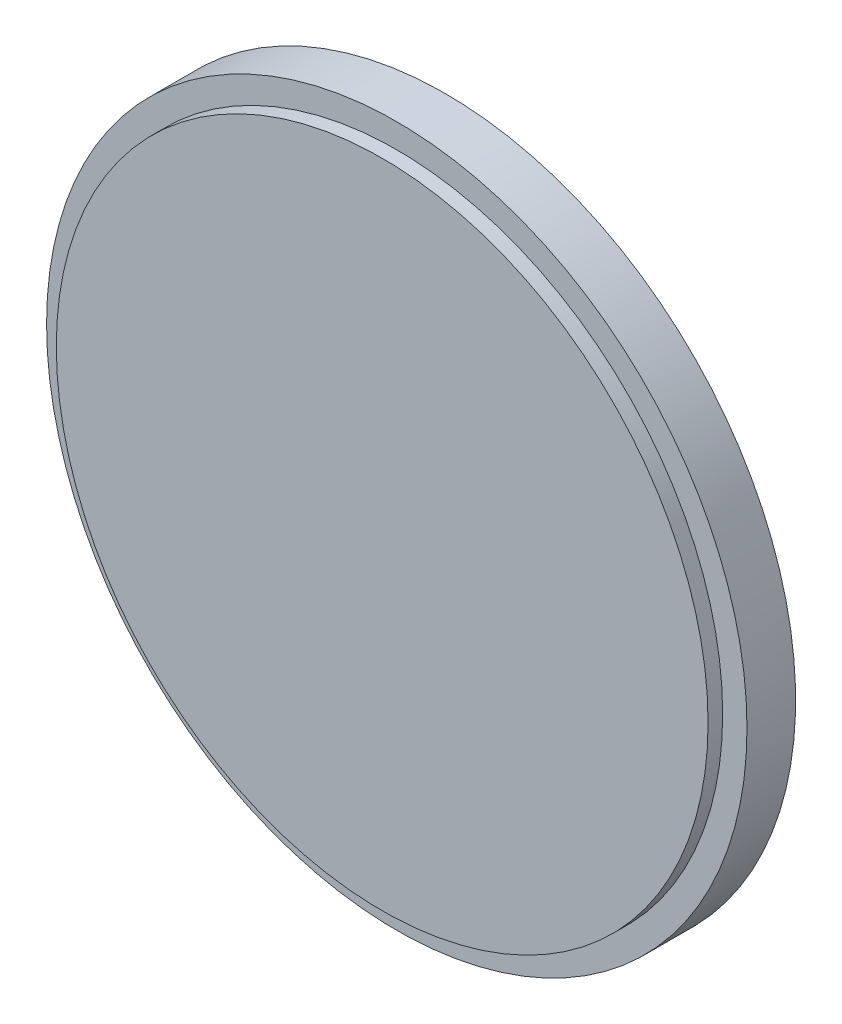
ISO-10303-21;
HEADER;
FILE_DESCRIPTION(('STEP AP214'),'2;1');
FILE_NAME('part.step','',(''),(''),'','','');
FILE_SCHEMA(('AUTOMOTIVE_DESIGN { 1 0 10303 214 1 1 1 1 }'));
ENDSEC;
DATA;
#1=APPLICATION_CONTEXT('core data for automotive mechanical design processes');
#2=APPLICATION_PROTOCOL_DEFINITION('international standard','automotive_design',2000,#1);
#3=PRODUCT_CONTEXT('',#1,'mechanical');
#4=PRODUCT('Part','Part','',(#3));
#5=PRODUCT_RELATED_PRODUCT_CATEGORY('part','',(#4));
#6=PRODUCT_DEFINITION_FORMATION('','',#4);
#7=PRODUCT_DEFINITION_CONTEXT('part definition',#1,'design');
#8=PRODUCT_DEFINITION('design','',#6,#7);
#9=PRODUCT_DEFINITION_SHAPE('','',#8);
#10=(LENGTH_UNIT() NAMED_UNIT(*) SI_UNIT(.MILLI.,.METRE.));
#11=(NAMED_UNIT(*) PLANE_ANGLE_UNIT() SI_UNIT($,.RADIAN.));
#12=(NAMED_UNIT(*) SI_UNIT($,.STERADIAN.) SOLID_ANGLE_UNIT());
#13=UNCERTAINTY_MEASURE_WITH_UNIT(LENGTH_MEASURE(1.E-05),#10,'distance_accuracy_value','');
#14=(GEOMETRIC_REPRESENTATION_CONTEXT(3) GLOBAL_UNCERTAINTY_ASSIGNED_CONTEXT((#13)) GLOBAL_UNIT_ASSIGNED_CONTEXT((#10,
#11,#12)) REPRESENTATION_CONTEXT('',''));
#15=CARTESIAN_POINT('',(0.,0.,0.));
#16=DIRECTION('',(0.,0.,1.));
#17=DIRECTION('',(1.,0.,0.));
#18=AXIS2_PLACEMENT_3D('',#15,#16,#17);
#19=CARTESIAN_POINT('',(0.,0.,0.));
#20=DIRECTION('',(0.,0.,-1.));
#21=DIRECTION('',(-1.,0.,0.));
#22=AXIS2_PLACEMENT_3D('',#19,#20,#21);
#23=CYLINDRICAL_SURFACE('',#22,1.65);
#24=CARTESIAN_POINT('',(0.,0.,-6.85));
#25=DIRECTION('',(0.,-0.707106781186547,-0.707106781186547));
#26=DIRECTION('',(0.,0.707106781186547,-0.707106781186547));
#27=AXIS2_PLACEMENT_3D('',#24,#25,#26);
#28=ELLIPSE('',#27,2.33345237791561,1.65);
#29=CARTESIAN_POINT('',(-1.22983738762488,1.1,-7.95));
#30=VERTEX_POINT('',#29);
#31=CARTESIAN_POINT('',(-1.65,0.,-6.85));
#32=VERTEX_POINT('',#31);
#33=EDGE_CURVE('E59',#30,#32,#28,.F.);
#34=ORIENTED_EDGE('',*,*,#33,.T.);
#35=CARTESIAN_POINT('',(0.,0.,-6.85));
#36=DIRECTION('',(0.,0.707106781186547,-0.707106781186547));
#37=DIRECTION('',(0.,-0.707106781186547,-0.707106781186547));
#38=AXIS2_PLACEMENT_3D('',#35,#36,#37);
#39=ELLIPSE('',#38,2.33345237791561,1.65);
#40=CARTESIAN_POINT('',(1.65,0.,-6.85));
#41=VERTEX_POINT('',#40);
#42=EDGE_CURVE('E147',#32,#41,#39,.F.);
#43=ORIENTED_EDGE('',*,*,#42,.T.);
#44=CARTESIAN_POINT('',(1.22983738762488,1.1,-7.95));
#45=VERTEX_POINT('',#44);
#46=EDGE_CURVE('E53',#41,#45,#28,.F.);
#47=ORIENTED_EDGE('',*,*,#46,.T.);
#48=DIRECTION('',(0.,0.,-1.));
#49=VECTOR('',#48,1.);
#50=CARTESIAN_POINT('',(1.22983738762488,1.1,0.));
#51=LINE('',#50,#49);
#52=CARTESIAN_POINT('',(1.22983738762488,1.1,-11.));
#53=VERTEX_POINT('',#52);
#54=EDGE_CURVE('E153',#45,#53,#51,.T.);
#55=ORIENTED_EDGE('',*,*,#54,.T.);
#56=CARTESIAN_POINT('',(0.,0.,-11.));
#57=DIRECTION('',(0.,0.,-1.));
#58=DIRECTION('',(-1.,0.,0.));
#59=AXIS2_PLACEMENT_3D('',#56,#57,#58);
#60=CIRCLE('',#59,1.65);
#61=CARTESIAN_POINT('',(-1.22983738762488,1.1,-11.));
#62=VERTEX_POINT('',#61);
#63=EDGE_CURVE('E313',#53,#62,#60,.T.);
#64=ORIENTED_EDGE('',*,*,#63,.T.);
#65=DIRECTION('',(0.,0.,-1.));
#66=VECTOR('',#65,1.);
#67=CARTESIAN_POINT('',(-1.22983738762488,1.1,0.));
#68=LINE('',#67,#66);
#69=EDGE_CURVE('E154',#30,#62,#68,.T.);
#70=ORIENTED_EDGE('',*,*,#69,.F.);
#71=EDGE_LOOP('',(#34,#43,#47,#55,#64,#70));
#72=FACE_BOUND('',#71,.T.);
#73=ADVANCED_FACE('F38',(#72),#23,.F.);
#74=CARTESIAN_POINT('',(1.22983738762488,1.1,0.));
#75=DIRECTION('',(0.,1.,0.));
#76=DIRECTION('',(0.,0.,1.));
#77=AXIS2_PLACEMENT_3D('',#74,#75,#76);
#78=PLANE('',#77);
#79=ORIENTED_EDGE('',*,*,#54,.F.);
#80=CARTESIAN_POINT('',(0.,1.1,-6.85));
#81=DIRECTION('',(0.,1.,0.));
#82=DIRECTION('',(0.,0.,1.));
#83=AXIS2_PLACEMENT_3D('',#80,#81,#82);
#84=CIRCLE('',#83,1.65);
#85=EDGE_CURVE('E11',#45,#30,#84,.T.);
#86=ORIENTED_EDGE('',*,*,#85,.T.);
#87=ORIENTED_EDGE('',*,*,#69,.T.);
#88=DIRECTION('',(1.,0.,0.));
#89=VECTOR('',#88,1.);
#90=CARTESIAN_POINT('',(1.22983738762488,1.1,-11.));
#91=LINE('',#90,#89);
#92=EDGE_CURVE('E422',#62,#53,#91,.T.);
#93=ORIENTED_EDGE('',*,*,#92,.T.);
#94=EDGE_LOOP('',(#79,#86,#87,#93));
#95=FACE_BOUND('',#94,.T.);
#96=ADVANCED_FACE('F278',(#95),#78,.F.);
#97=CARTESIAN_POINT('',(0.,0.,1.5));
#98=DIRECTION('',(0.,0.,-1.));
#99=DIRECTION('',(-1.,0.,0.));
#100=AXIS2_PLACEMENT_3D('',#97,#98,#99);
#101=PLANE('',#100);
#102=CARTESIAN_POINT('',(0.,0.,1.5));
#103=DIRECTION('',(0.,0.,-1.));
#104=DIRECTION('',(-1.,0.,0.));
#105=AXIS2_PLACEMENT_3D('',#102,#103,#104);
#106=CIRCLE('',#105,33.5);
#107=CARTESIAN_POINT('',(-33.5,0.,1.5));
#108=VERTEX_POINT('',#107);
#109=EDGE_CURVE('E237',#108,#108,#106,.T.);
#110=ORIENTED_EDGE('',*,*,#109,.F.);
#111=EDGE_LOOP('',(#110));
#112=FACE_BOUND('',#111,.T.);
#113=CARTESIAN_POINT('',(0.,0.,1.5));
#114=DIRECTION('',(0.,0.,-1.));
#115=DIRECTION('',(-1.,0.,0.));
#116=AXIS2_PLACEMENT_3D('',#113,#114,#115);
#117=CIRCLE('',#116,36.);
#118=CARTESIAN_POINT('',(-36.,0.,1.5));
#119=VERTEX_POINT('',#118);
#120=EDGE_CURVE('E160',#119,#119,#117,.T.);
#121=ORIENTED_EDGE('',*,*,#120,.T.);
#122=EDGE_LOOP('',(#121));
#123=FACE_BOUND('',#122,.T.);
#124=ADVANCED_FACE('F284',(#112,#123),#101,.T.);
#125=CARTESIAN_POINT('',(0.,0.,0.));
#126=DIRECTION('',(0.,0.,1.));
#127=DIRECTION('',(1.,0.,0.));
#128=AXIS2_PLACEMENT_3D('',#125,#126,#127);
#129=PLANE('',#128);
#130=CARTESIAN_POINT('',(0.,0.,0.));
#131=DIRECTION('',(0.,0.,1.));
#132=DIRECTION('',(1.,0.,0.));
#133=AXIS2_PLACEMENT_3D('',#130,#131,#132);
#134=CIRCLE('',#133,32.5);
#135=CARTESIAN_POINT('',(32.5,0.,0.));
#136=VERTEX_POINT('',#135);
#137=EDGE_CURVE('E251',#136,#136,#134,.T.);
#138=ORIENTED_EDGE('',*,*,#137,.T.);
#139=EDGE_LOOP('',(#138));
#140=FACE_BOUND('',#139,.T.);
#141=CARTESIAN_POINT('',(0.,0.,0.));
#142=DIRECTION('',(0.,0.,-1.));
#143=DIRECTION('',(-1.,0.,0.));
#144=AXIS2_PLACEMENT_3D('',#141,#142,#143);
#145=CIRCLE('',#144,33.5);
#146=CARTESIAN_POINT('',(-33.5,0.,0.));
#147=VERTEX_POINT('',#146);
#148=EDGE_CURVE('E236',#147,#147,#145,.T.);
#149=ORIENTED_EDGE('',*,*,#148,.T.);
#150=EDGE_LOOP('',(#149));
#151=FACE_BOUND('',#150,.T.);
#152=ADVANCED_FACE('F40',(#140,#151),#129,.F.);
#153=CARTESIAN_POINT('',(0.,0.,8.));
#154=DIRECTION('',(0.,0.,-1.));
#155=DIRECTION('',(-1.,0.,0.));
#156=AXIS2_PLACEMENT_3D('',#153,#154,#155);
#157=CYLINDRICAL_SURFACE('',#156,32.5);
#158=ORIENTED_EDGE('',*,*,#137,.F.);
#159=EDGE_LOOP('',(#158));
#160=FACE_BOUND('',#159,.T.);
#161=CARTESIAN_POINT('',(0.,0.,5.));
#162=DIRECTION('',(0.,0.,1.));
#163=DIRECTION('',(1.,0.,0.));
#164=AXIS2_PLACEMENT_3D('',#161,#162,#163);
#165=CIRCLE('',#164,32.5);
#166=CARTESIAN_POINT('',(32.5,0.,5.));
#167=VERTEX_POINT('',#166);
#168=EDGE_CURVE('E246',#167,#167,#165,.T.);
#169=ORIENTED_EDGE('',*,*,#168,.T.);
#170=EDGE_LOOP('',(#169));
#171=FACE_BOUND('',#170,.T.);
#172=ADVANCED_FACE('F342',(#160,#171),#157,.F.);
#173=CARTESIAN_POINT('',(0.,0.,5.));
#174=DIRECTION('',(0.,0.,1.));
#175=DIRECTION('',(1.,0.,0.));
#176=AXIS2_PLACEMENT_3D('',#173,#174,#175);
#177=PLANE('',#176);
#178=CARTESIAN_POINT('',(0.,0.,5.));
#179=DIRECTION('',(0.,0.,1.));
#180=DIRECTION('',(1.,0.,0.));
#181=AXIS2_PLACEMENT_3D('',#178,#179,#180);
#182=CIRCLE('',#181,10.);
#183=CARTESIAN_POINT('',(10.,0.,5.));
#184=VERTEX_POINT('',#183);
#185=EDGE_CURVE('E254',#184,#184,#182,.F.);
#186=ORIENTED_EDGE('',*,*,#185,.F.);
#187=EDGE_LOOP('',(#186));
#188=FACE_BOUND('',#187,.T.);
#189=ORIENTED_EDGE('',*,*,#168,.F.);
#190=EDGE_LOOP('',(#189));
#191=FACE_BOUND('',#190,.T.);
#192=ADVANCED_FACE('F326',(#188,#191),#177,.F.);
#193=CARTESIAN_POINT('',(0.,0.,1.5));
#194=DIRECTION('',(0.,0.,-1.));
#195=DIRECTION('',(-1.,0.,0.));
#196=AXIS2_PLACEMENT_3D('',#193,#194,#195);
#197=CYLINDRICAL_SURFACE('',#196,33.5);
#198=ORIENTED_EDGE('',*,*,#109,.T.);
#199=EDGE_LOOP('',(#198));
#200=FACE_BOUND('',#199,.T.);
#201=ORIENTED_EDGE('',*,*,#148,.F.);
#202=EDGE_LOOP('',(#201));
#203=FACE_BOUND('',#202,.T.);
#204=ADVANCED_FACE('F321',(#200,#203),#197,.T.);
#205=CARTESIAN_POINT('',(0.,0.,-11.));
#206=DIRECTION('',(0.,0.,1.));
#207=DIRECTION('',(1.,0.,0.));
#208=AXIS2_PLACEMENT_3D('',#205,#206,#207);
#209=CYLINDRICAL_SURFACE('',#208,10.);
#210=CARTESIAN_POINT('',(-1.65,-9.86293566845085,-6.85));
#211=CARTESIAN_POINT('',(-1.64999629098035,-9.86293731785559,-6.75799815763411));
#212=CARTESIAN_POINT('',(-1.64227909123111,-9.86423691212932,-6.66594574295345));
#213=CARTESIAN_POINT('',(-1.61162706431045,-9.86929026153225,-6.48442278665811));
#214=CARTESIAN_POINT('',(-1.58867811875357,-9.8730462934991,-6.39495472085215));
#215=CARTESIAN_POINT('',(-1.5282748949929,-9.88257579035621,-6.22125382338446));
#216=CARTESIAN_POINT('',(-1.49083263568619,-9.888347583246,-6.13701672082335));
#217=CARTESIAN_POINT('',(-1.40253539774319,-9.90125628915054,-5.97602977552741));
#218=CARTESIAN_POINT('',(-1.3516819635744,-9.90839304494647,-5.89927907203176));
#219=CARTESIAN_POINT('',(-1.23748166219591,-9.92330460813677,-5.75469249754825));
#220=CARTESIAN_POINT('',(-1.17403055174128,-9.93108439980271,-5.68693946492918));
#221=CARTESIAN_POINT('',(-1.03666129953611,-9.94636114892746,-5.56299083427328));
#222=CARTESIAN_POINT('',(-0.962742542660852,-9.95385808973191,-5.50679591591812));
#223=CARTESIAN_POINT('',(-0.806000158090802,-9.96777711815929,-5.40724831658915));
#224=CARTESIAN_POINT('',(-0.723126989054619,-9.97419266457576,-5.36397264811038));
#225=CARTESIAN_POINT('',(-0.551164106325249,-9.98517060701297,-5.29198691122183));
#226=CARTESIAN_POINT('',(-0.462074789289344,-9.98973312115065,-5.26327591439407));
#227=CARTESIAN_POINT('',(-0.281064093113008,-9.99645574381605,-5.22148765336424));
#228=CARTESIAN_POINT('',(-0.189175642116498,-9.99863722113475,-5.20827125081373));
#229=CARTESIAN_POINT('',(-0.00446128175041647,-10.0004253754509,-5.19741474747605));
#230=CARTESIAN_POINT('',(0.0883645646994466,-10.0000322241302,-5.19977360809645));
#231=CARTESIAN_POINT('',(0.271367618037823,-9.9967323508907,-5.21989202770408));
#232=CARTESIAN_POINT('',(0.361561789664357,-9.99385006818958,-5.23750185181637));
#233=CARTESIAN_POINT('',(0.537697224998589,-9.98592303427217,-5.28738661870974));
#234=CARTESIAN_POINT('',(0.623638361119403,-9.98087821822581,-5.31966200114778));
#235=CARTESIAN_POINT('',(0.789274301179368,-9.96915130593382,-5.39811098155924));
#236=CARTESIAN_POINT('',(0.868939282087197,-9.96246194992932,-5.44434641796588));
#237=CARTESIAN_POINT('',(1.01943645906904,-9.9481893971331,-5.54935776294151));
#238=CARTESIAN_POINT('',(1.09026795344527,-9.94060612942547,-5.60813466675174));
#239=CARTESIAN_POINT('',(1.22197197095426,-9.9252829108151,-5.73739135719332));
#240=CARTESIAN_POINT('',(1.28271604906534,-9.9175421690508,-5.80800199873007));
#241=CARTESIAN_POINT('',(1.3915146973154,-9.90286372793617,-5.95848050325953));
#242=CARTESIAN_POINT('',(1.43956915487058,-9.89592603571091,-6.03834844837508));
#243=CARTESIAN_POINT('',(1.52164889999091,-9.88363886477131,-6.20522179378199));
#244=CARTESIAN_POINT('',(1.55565895856361,-9.87829111185156,-6.29223481993177));
#245=CARTESIAN_POINT('',(1.60854450758027,-9.86981807463769,-6.47084660028683));
#246=CARTESIAN_POINT('',(1.62742130248435,-9.8666925987899,-6.56244495852144));
#247=CARTESIAN_POINT('',(1.64932410589818,-9.86305497953645,-6.74647869507773));
#248=CARTESIAN_POINT('',(1.6525331076067,-9.86251266770398,-6.83889171756022));
#249=CARTESIAN_POINT('',(1.64349666278561,-9.86402245062659,-7.022934586635));
#250=CARTESIAN_POINT('',(1.63125180079262,-9.86607444725293,-7.11456446271754));
#251=CARTESIAN_POINT('',(1.59181115051362,-9.87251378234871,-7.29386021319912));
#252=CARTESIAN_POINT('',(1.56470830150066,-9.87688659832881,-7.38154709960179));
#253=CARTESIAN_POINT('',(1.49641841835946,-9.88746270071878,-7.55113420759304));
#254=CARTESIAN_POINT('',(1.45523055679538,-9.89366609466455,-7.63303408887804));
#255=CARTESIAN_POINT('',(1.35950711966145,-9.90727458613196,-7.78953738917548));
#256=CARTESIAN_POINT('',(1.3048541529275,-9.91469004820881,-7.86406808987048));
#257=CARTESIAN_POINT('',(1.183913241756,-9.92985673064712,-8.00296602506892));
#258=CARTESIAN_POINT('',(1.11762449587139,-9.93760797410877,-8.06733255890625));
#259=CARTESIAN_POINT('',(0.974483484791731,-9.95266815580003,-8.18474209808012));
#260=CARTESIAN_POINT('',(0.897530542660934,-9.95997178743297,-8.23766314576579));
#261=CARTESIAN_POINT('',(0.735720107735908,-9.97322896699239,-8.32982570565766));
#262=CARTESIAN_POINT('',(0.650862866786069,-9.97918255791273,-8.36906765351442));
#263=CARTESIAN_POINT('',(0.476016852877795,-9.98904576356827,-8.43256776434511));
#264=CARTESIAN_POINT('',(0.386051879990883,-9.99296411355053,-8.45689004529765));
#265=CARTESIAN_POINT('',(0.203244410238662,-9.99835224840596,-8.49006697360011));
#266=CARTESIAN_POINT('',(0.11040214584364,-9.99982223057197,-8.49892286725558));
#267=CARTESIAN_POINT('',(-0.0743467418035942,-10.000145298838,-8.50088033932715));
#268=CARTESIAN_POINT('',(-0.166251396930955,-9.99902922611947,-8.49416758785562));
#269=CARTESIAN_POINT('',(-0.347605270735726,-9.99436846725468,-8.46557953808797));
#270=CARTESIAN_POINT('',(-0.43705450249768,-9.99082379405267,-8.44370432060643));
#271=CARTESIAN_POINT('',(-0.610889563964932,-9.98170266675398,-8.38548299259324));
#272=CARTESIAN_POINT('',(-0.695280700367389,-9.97612838706588,-8.34915236494125));
#273=CARTESIAN_POINT('',(-0.856798143174383,-9.96355694814414,-8.26307208786864));
#274=CARTESIAN_POINT('',(-0.933924116084171,-9.95655972363921,-8.21332182284739));
#275=CARTESIAN_POINT('',(-1.07965789685337,-9.94181931422729,-8.10115490006128));
#276=CARTESIAN_POINT('',(-1.14816021705336,-9.93406862876239,-8.03860215785098));
#277=CARTESIAN_POINT('',(-1.27376166628459,-9.91874715128115,-7.90289162780784));
#278=CARTESIAN_POINT('',(-1.33085812058581,-9.91117640182652,-7.82973135938494));
#279=CARTESIAN_POINT('',(-1.43238917357863,-9.8970154548119,-7.67428217423066));
#280=CARTESIAN_POINT('',(-1.47673345800304,-9.89043240198641,-7.59193361471933));
#281=CARTESIAN_POINT('',(-1.55089189624868,-9.87907656402569,-7.42088196298602));
#282=CARTESIAN_POINT('',(-1.58072062483371,-9.87430196413345,-7.33218534781588));
#283=CARTESIAN_POINT('',(-1.61849251524498,-9.86816715424855,-7.17761470046375));
#284=CARTESIAN_POINT('',(-1.63028895802673,-9.86621620214801,-7.11267863497413));
#285=CARTESIAN_POINT('',(-1.64604396057966,-9.86359987952975,-6.98183702563077));
#286=CARTESIAN_POINT('',(-1.65000265800356,-9.86293448643402,-6.91593149882396));
#287=CARTESIAN_POINT('',(-1.65,-9.86293566845085,-6.85));
#288=B_SPLINE_CURVE_WITH_KNOTS('',3,(#210,#211,#212,#213,#214,#215,#216,#217,#218,#219,#220,
#221,#222,#223,#224,#225,#226,#227,#228,#229,#230,#231,#232,#233,#234,#235,#236,#237,#238,#239,
#240,#241,#242,#243,#244,#245,#246,#247,#248,#249,#250,#251,#252,#253,#254,#255,#256,#257,#258,
#259,#260,#261,#262,#263,#264,#265,#266,#267,#268,#269,#270,#271,#272,#273,#274,#275,#276,#277,
#278,#279,#280,#281,#282,#283,#284,#285,#286,#287),.UNSPECIFIED.,.T.,.F.,(4,2,2,2,2,2,2,2,2,2,2,
2,2,2,2,2,2,2,2,2,2,2,2,2,2,2,2,2,2,2,2,2,2,2,2,2,2,2,4),(0.,0.275764439202393,
0.551784843546747,0.827576840629571,1.10333709061228,1.38148219258883,1.65964364637686,
1.9394315673533,2.2192016511418,2.49643973106728,2.77365932434104,3.0481876234325,
3.32272415311684,3.59849508924515,3.87428791760822,4.15336037881898,4.4324353159104,
4.71181207725748,4.99116475423999,5.26724677423094,5.54331835183579,5.81768243813567,
6.09206264495278,6.36892529029642,6.64580701282283,6.92550769092015,7.20519946032494,
7.48368066222358,7.76213942263838,8.03729441534009,8.31244794150179,8.58730754656388,
8.8621797624382,9.14014153059558,9.41816840579303,9.69811840194762,9.97778672322852,
10.175411919191,10.3730336442719),.UNSPECIFIED.);
#289=CARTESIAN_POINT('',(-1.65,-9.86293566845085,-6.85));
#290=VERTEX_POINT('',#289);
#291=EDGE_CURVE('E307',#290,#290,#288,.T.);
#292=ORIENTED_EDGE('',*,*,#291,.T.);
#293=EDGE_LOOP('',(#292));
#294=FACE_BOUND('',#293,.T.);
#295=CARTESIAN_POINT('',(-1.65,9.86293566845085,-6.85));
#296=CARTESIAN_POINT('',(-1.64999629098035,9.86293731785559,-6.94200184236589));
#297=CARTESIAN_POINT('',(-1.64227909123111,9.86423691212932,-7.03405425704655));
#298=CARTESIAN_POINT('',(-1.61162706431046,9.86929026153224,-7.21557721334188));
#299=CARTESIAN_POINT('',(-1.58867811875357,9.8730462934991,-7.30504527914785));
#300=CARTESIAN_POINT('',(-1.52827489499291,9.88257579035621,-7.47874617661554));
#301=CARTESIAN_POINT('',(-1.49083263568619,9.888347583246,-7.56298327917665));
#302=CARTESIAN_POINT('',(-1.40253539774319,9.90125628915054,-7.72397022447259));
#303=CARTESIAN_POINT('',(-1.3516819635744,9.90839304494647,-7.80072092796823));
#304=CARTESIAN_POINT('',(-1.23748166219591,9.92330460813677,-7.94530750245175));
#305=CARTESIAN_POINT('',(-1.17403055174128,9.93108439980271,-8.01306053507082));
#306=CARTESIAN_POINT('',(-1.03666129953611,9.94636114892746,-8.13700916572672));
#307=CARTESIAN_POINT('',(-0.962742542660854,9.95385808973191,-8.19320408408188));
#308=CARTESIAN_POINT('',(-0.806000158090803,9.96777711815929,-8.29275168341085));
#309=CARTESIAN_POINT('',(-0.723126989054621,9.97419266457576,-8.33602735188962));
#310=CARTESIAN_POINT('',(-0.551164106325251,9.98517060701297,-8.40801308877817));
#311=CARTESIAN_POINT('',(-0.462074789289346,9.98973312115065,-8.43672408560593));
#312=CARTESIAN_POINT('',(-0.28106409311301,9.99645574381605,-8.47851234663575));
#313=CARTESIAN_POINT('',(-0.1891756421165,9.99863722113475,-8.49172874918627));
#314=CARTESIAN_POINT('',(-0.00446128175041889,10.0004253754509,-8.50258525252394));
#315=CARTESIAN_POINT('',(0.0883645646994441,10.0000322241302,-8.50022639190354));
#316=CARTESIAN_POINT('',(0.271367618037821,9.9967323508907,-8.48010797229592));
#317=CARTESIAN_POINT('',(0.361561789664355,9.99385006818958,-8.46249814818363));
#318=CARTESIAN_POINT('',(0.537697224998587,9.98592303427217,-8.41261338129025));
#319=CARTESIAN_POINT('',(0.623638361119401,9.98087821822581,-8.38033799885221));
#320=CARTESIAN_POINT('',(0.789274301179365,9.96915130593382,-8.30188901844076));
#321=CARTESIAN_POINT('',(0.868939282087195,9.96246194992932,-8.25565358203412));
#322=CARTESIAN_POINT('',(1.01943645906903,9.9481893971331,-8.15064223705848));
#323=CARTESIAN_POINT('',(1.09026795344527,9.94060612942547,-8.09186533324826));
#324=CARTESIAN_POINT('',(1.22197197095425,9.92528291081511,-7.96260864280668));
#325=CARTESIAN_POINT('',(1.28271604906533,9.9175421690508,-7.89199800126992));
#326=CARTESIAN_POINT('',(1.3915146973154,9.90286372793617,-7.74151949674046));
#327=CARTESIAN_POINT('',(1.43956915487058,9.89592603571091,-7.66165155162491));
#328=CARTESIAN_POINT('',(1.52164889999091,9.88363886477131,-7.49477820621801));
#329=CARTESIAN_POINT('',(1.55565895856361,9.87829111185156,-7.40776518006823));
#330=CARTESIAN_POINT('',(1.60854450758027,9.86981807463768,-7.22915339971316));
#331=CARTESIAN_POINT('',(1.62742130248435,9.8666925987899,-7.13755504147856));
#332=CARTESIAN_POINT('',(1.64932410589818,9.86305497953645,-6.95352130492226));
#333=CARTESIAN_POINT('',(1.6525331076067,9.86251266770398,-6.86110828243977));
#334=CARTESIAN_POINT('',(1.64349666278561,9.86402245062658,-6.67706541336499));
#335=CARTESIAN_POINT('',(1.63125180079262,9.86607444725293,-6.58543553728246));
#336=CARTESIAN_POINT('',(1.59181115051361,9.87251378234871,-6.40613978680087));
#337=CARTESIAN_POINT('',(1.56470830150066,9.87688659832881,-6.31845290039821));
#338=CARTESIAN_POINT('',(1.49641841835946,9.88746270071878,-6.14886579240696));
#339=CARTESIAN_POINT('',(1.45523055679537,9.89366609466455,-6.06696591112196));
#340=CARTESIAN_POINT('',(1.35950711966145,9.90727458613196,-5.91046261082451));
#341=CARTESIAN_POINT('',(1.3048541529275,9.91469004820881,-5.83593191012952));
#342=CARTESIAN_POINT('',(1.183913241756,9.92985673064712,-5.69703397493108));
#343=CARTESIAN_POINT('',(1.11762449587139,9.93760797410877,-5.63266744109375));
#344=CARTESIAN_POINT('',(0.974483484791727,9.95266815580003,-5.51525790191987));
#345=CARTESIAN_POINT('',(0.897530542660931,9.95997178743297,-5.4623368542342));
#346=CARTESIAN_POINT('',(0.735720107735904,9.97322896699239,-5.37017429434234));
#347=CARTESIAN_POINT('',(0.650862866786065,9.97918255791273,-5.33093234648557));
#348=CARTESIAN_POINT('',(0.476016852877791,9.98904576356827,-5.26743223565489));
#349=CARTESIAN_POINT('',(0.386051879990879,9.99296411355053,-5.24310995470235));
#350=CARTESIAN_POINT('',(0.203244410238657,9.99835224840596,-5.20993302639988));
#351=CARTESIAN_POINT('',(0.110402145843636,9.99982223057197,-5.20107713274442));
#352=CARTESIAN_POINT('',(-0.074346741803598,10.000145298838,-5.19911966067285));
#353=CARTESIAN_POINT('',(-0.16625139693096,9.99902922611947,-5.20583241214438));
#354=CARTESIAN_POINT('',(-0.347605270735731,9.99436846725468,-5.23442046191203));
#355=CARTESIAN_POINT('',(-0.437054502497684,9.99082379405267,-5.25629567939357));
#356=CARTESIAN_POINT('',(-0.610889563964935,9.98170266675398,-5.31451700740676));
#357=CARTESIAN_POINT('',(-0.695280700367392,9.97612838706588,-5.35084763505875));
#358=CARTESIAN_POINT('',(-0.856798143174387,9.96355694814414,-5.43692791213136));
#359=CARTESIAN_POINT('',(-0.933924116084175,9.95655972363921,-5.4866781771526));
#360=CARTESIAN_POINT('',(-1.07965789685337,9.94181931422729,-5.59884509993872));
#361=CARTESIAN_POINT('',(-1.14816021705336,9.93406862876239,-5.66139784214902));
#362=CARTESIAN_POINT('',(-1.27376166628459,9.91874715128115,-5.79710837219216));
#363=CARTESIAN_POINT('',(-1.33085812058581,9.91117640182651,-5.87026864061506));
#364=CARTESIAN_POINT('',(-1.43238917357863,9.8970154548119,-6.02571782576933));
#365=CARTESIAN_POINT('',(-1.47673345800304,9.89043240198641,-6.10806638528067));
#366=CARTESIAN_POINT('',(-1.55089189624868,9.87907656402569,-6.27911803701397));
#367=CARTESIAN_POINT('',(-1.58072062483372,9.87430196413345,-6.36781465218411));
#368=CARTESIAN_POINT('',(-1.61849251524499,9.86816715424855,-6.52238529953625));
#369=CARTESIAN_POINT('',(-1.63028895802673,9.86621620214801,-6.58732136502587));
#370=CARTESIAN_POINT('',(-1.64604396057966,9.86359987952975,-6.71816297436922));
#371=CARTESIAN_POINT('',(-1.65000265800356,9.86293448643401,-6.78406850117603));
#372=CARTESIAN_POINT('',(-1.65,9.86293566845085,-6.85));
#373=B_SPLINE_CURVE_WITH_KNOTS('',3,(#295,#296,#297,#298,#299,#300,#301,#302,#303,#304,#305,
#306,#307,#308,#309,#310,#311,#312,#313,#314,#315,#316,#317,#318,#319,#320,#321,#322,#323,#324,
#325,#326,#327,#328,#329,#330,#331,#332,#333,#334,#335,#336,#337,#338,#339,#340,#341,#342,#343,
#344,#345,#346,#347,#348,#349,#350,#351,#352,#353,#354,#355,#356,#357,#358,#359,#360,#361,#362,
#363,#364,#365,#366,#367,#368,#369,#370,#371,#372),.UNSPECIFIED.,.T.,.F.,(4,2,2,2,2,2,2,2,2,2,2,
2,2,2,2,2,2,2,2,2,2,2,2,2,2,2,2,2,2,2,2,2,2,2,2,2,2,2,4),(0.,0.275764439202393,
0.551784843546747,0.827576840629573,1.10333709061229,1.38148219258883,1.65964364637686,
1.9394315673533,2.2192016511418,2.49643973106728,2.77365932434104,3.0481876234325,
3.32272415311684,3.59849508924515,3.87428791760822,4.15336037881898,4.4324353159104,
4.71181207725748,4.99116475423999,5.26724677423095,5.54331835183579,5.81768243813567,
6.09206264495278,6.36892529029642,6.64580701282283,6.92550769092015,7.20519946032494,
7.48368066222358,7.76213942263839,8.0372944153401,8.31244794150179,8.58730754656389,
8.86217976243821,9.14014153059558,9.41816840579303,9.69811840194762,9.97778672322852,
10.175411919191,10.3730336442719),.UNSPECIFIED.);
#374=CARTESIAN_POINT('',(-1.65,9.86293566845085,-6.85));
#375=VERTEX_POINT('',#374);
#376=EDGE_CURVE('E300',#375,#375,#373,.T.);
#377=ORIENTED_EDGE('',*,*,#376,.T.);
#378=EDGE_LOOP('',(#377));
#379=FACE_BOUND('',#378,.T.);
#380=CARTESIAN_POINT('',(0.,0.,-11.));
#381=DIRECTION('',(0.,0.,-1.));
#382=DIRECTION('',(-1.,0.,0.));
#383=AXIS2_PLACEMENT_3D('',#380,#381,#382);
#384=CIRCLE('',#383,10.);
#385=CARTESIAN_POINT('',(-10.,0.,-11.));
#386=VERTEX_POINT('',#385);
#387=EDGE_CURVE('E233',#386,#386,#384,.T.);
#388=ORIENTED_EDGE('',*,*,#387,.F.);
#389=EDGE_LOOP('',(#388));
#390=FACE_BOUND('',#389,.T.);
#391=ORIENTED_EDGE('',*,*,#185,.T.);
#392=EDGE_LOOP('',(#391));
#393=FACE_BOUND('',#392,.T.);
#394=ADVANCED_FACE('F316',(#294,#379,#390,#393),#209,.T.);
#395=CARTESIAN_POINT('',(0.,0.,-11.));
#396=DIRECTION('',(0.,0.,-1.));
#397=DIRECTION('',(-1.,0.,0.));
#398=AXIS2_PLACEMENT_3D('',#395,#396,#397);
#399=PLANE('',#398);
#400=DIRECTION('',(1.,0.,0.));
#401=VECTOR('',#400,1.);
#402=CARTESIAN_POINT('',(-2.975,7.95,-11.));
#403=LINE('',#402,#401);
#404=CARTESIAN_POINT('',(-2.975,7.95,-11.));
#405=VERTEX_POINT('',#404);
#406=CARTESIAN_POINT('',(2.975,7.95,-11.));
#407=VERTEX_POINT('',#406);
#408=EDGE_CURVE('E181',#405,#407,#403,.T.);
#409=ORIENTED_EDGE('',*,*,#408,.F.);
#410=DIRECTION('',(0.,1.,0.));
#411=VECTOR('',#410,1.);
#412=CARTESIAN_POINT('',(-2.975,5.3,-11.));
#413=LINE('',#412,#411);
#414=CARTESIAN_POINT('',(-2.975,5.3,-11.));
#415=VERTEX_POINT('',#414);
#416=EDGE_CURVE('E171',#415,#405,#413,.T.);
#417=ORIENTED_EDGE('',*,*,#416,.F.);
#418=DIRECTION('',(-1.,0.,0.));
#419=VECTOR('',#418,1.);
#420=CARTESIAN_POINT('',(2.975,5.3,-11.));
#421=LINE('',#420,#419);
#422=CARTESIAN_POINT('',(2.975,5.3,-11.));
#423=VERTEX_POINT('',#422);
#424=EDGE_CURVE('E187',#423,#415,#421,.T.);
#425=ORIENTED_EDGE('',*,*,#424,.F.);
#426=DIRECTION('',(0.,-1.,0.));
#427=VECTOR('',#426,1.);
#428=CARTESIAN_POINT('',(2.975,7.95,-11.));
#429=LINE('',#428,#427);
#430=EDGE_CURVE('E183',#407,#423,#429,.T.);
#431=ORIENTED_EDGE('',*,*,#430,.F.);
#432=EDGE_LOOP('',(#409,#417,#425,#431));
#433=FACE_BOUND('',#432,.T.);
#434=DIRECTION('',(0.,1.,0.));
#435=VECTOR('',#434,1.);
#436=CARTESIAN_POINT('',(-2.975,-5.3,-11.));
#437=LINE('',#436,#435);
#438=CARTESIAN_POINT('',(-2.975,-7.95,-11.));
#439=VERTEX_POINT('',#438);
#440=CARTESIAN_POINT('',(-2.975,-5.3,-11.));
#441=VERTEX_POINT('',#440);
#442=EDGE_CURVE('E166',#439,#441,#437,.T.);
#443=ORIENTED_EDGE('',*,*,#442,.F.);
#444=DIRECTION('',(-1.,0.,0.));
#445=VECTOR('',#444,1.);
#446=CARTESIAN_POINT('',(-2.975,-7.95,-11.));
#447=LINE('',#446,#445);
#448=CARTESIAN_POINT('',(2.975,-7.95,-11.));
#449=VERTEX_POINT('',#448);
#450=EDGE_CURVE('E205',#449,#439,#447,.T.);
#451=ORIENTED_EDGE('',*,*,#450,.F.);
#452=DIRECTION('',(0.,-1.,0.));
#453=VECTOR('',#452,1.);
#454=CARTESIAN_POINT('',(2.975,-7.95,-11.));
#455=LINE('',#454,#453);
#456=CARTESIAN_POINT('',(2.975,-5.3,-11.));
#457=VERTEX_POINT('',#456);
#458=EDGE_CURVE('E219',#457,#449,#455,.T.);
#459=ORIENTED_EDGE('',*,*,#458,.F.);
#460=DIRECTION('',(1.,0.,0.));
#461=VECTOR('',#460,1.);
#462=CARTESIAN_POINT('',(2.975,-5.3,-11.));
#463=LINE('',#462,#461);
#464=EDGE_CURVE('E216',#441,#457,#463,.T.);
#465=ORIENTED_EDGE('',*,*,#464,.F.);
#466=EDGE_LOOP('',(#443,#451,#459,#465));
#467=FACE_BOUND('',#466,.T.);
#468=ORIENTED_EDGE('',*,*,#387,.T.);
#469=EDGE_LOOP('',(#468));
#470=FACE_BOUND('',#469,.T.);
#471=ORIENTED_EDGE('',*,*,#63,.F.);
#472=ORIENTED_EDGE('',*,*,#92,.F.);
#473=EDGE_LOOP('',(#471,#472));
#474=FACE_BOUND('',#473,.T.);
#475=ADVANCED_FACE('F320',(#433,#467,#470,#474),#399,.T.);
#476=CARTESIAN_POINT('',(-2.975,-5.3,-3.));
#477=DIRECTION('',(-1.,0.,0.));
#478=DIRECTION('',(0.,-1.,0.));
#479=AXIS2_PLACEMENT_3D('',#476,#477,#478);
#480=PLANE('',#479);
#481=ORIENTED_EDGE('',*,*,#442,.T.);
#482=DIRECTION('',(0.,0.,-1.));
#483=VECTOR('',#482,1.);
#484=CARTESIAN_POINT('',(-2.975,-5.3,-3.));
#485=LINE('',#484,#483);
#486=CARTESIAN_POINT('',(-2.975,-5.3,-3.));
#487=VERTEX_POINT('',#486);
#488=EDGE_CURVE('E214',#487,#441,#485,.T.);
#489=ORIENTED_EDGE('',*,*,#488,.F.);
#490=DIRECTION('',(0.,1.,0.));
#491=VECTOR('',#490,1.);
#492=CARTESIAN_POINT('',(-2.975,-5.3,-3.));
#493=LINE('',#492,#491);
#494=CARTESIAN_POINT('',(-2.975,-7.95,-3.));
#495=VERTEX_POINT('',#494);
#496=EDGE_CURVE('E201',#495,#487,#493,.T.);
#497=ORIENTED_EDGE('',*,*,#496,.F.);
#498=DIRECTION('',(0.,0.,-1.));
#499=VECTOR('',#498,1.);
#500=CARTESIAN_POINT('',(-2.975,-7.95,-3.));
#501=LINE('',#500,#499);
#502=EDGE_CURVE('E184',#495,#439,#501,.T.);
#503=ORIENTED_EDGE('',*,*,#502,.T.);
#504=EDGE_LOOP('',(#481,#489,#497,#503));
#505=FACE_BOUND('',#504,.T.);
#506=ADVANCED_FACE('F390',(#505),#480,.F.);
#507=CARTESIAN_POINT('',(-2.975,-7.95,-3.));
#508=DIRECTION('',(0.,-1.,0.));
#509=DIRECTION('',(1.,0.,0.));
#510=AXIS2_PLACEMENT_3D('',#507,#508,#509);
#511=PLANE('',#510);
#512=CARTESIAN_POINT('',(0.,-7.95,-6.85));
#513=DIRECTION('',(0.,-1.,0.));
#514=DIRECTION('',(1.,0.,0.));
#515=AXIS2_PLACEMENT_3D('',#512,#513,#514);
#516=CIRCLE('',#515,1.65);
#517=CARTESIAN_POINT('',(1.65,-7.95,-6.85));
#518=VERTEX_POINT('',#517);
#519=EDGE_CURVE('E440',#518,#518,#516,.T.);
#520=ORIENTED_EDGE('',*,*,#519,.T.);
#521=EDGE_LOOP('',(#520));
#522=FACE_BOUND('',#521,.T.);
#523=ORIENTED_EDGE('',*,*,#450,.T.);
#524=ORIENTED_EDGE('',*,*,#502,.F.);
#525=DIRECTION('',(-1.,0.,0.));
#526=VECTOR('',#525,1.);
#527=CARTESIAN_POINT('',(-2.975,-7.95,-3.));
#528=LINE('',#527,#526);
#529=CARTESIAN_POINT('',(2.975,-7.95,-3.));
#530=VERTEX_POINT('',#529);
#531=EDGE_CURVE('E211',#530,#495,#528,.T.);
#532=ORIENTED_EDGE('',*,*,#531,.F.);
#533=DIRECTION('',(0.,0.,-1.));
#534=VECTOR('',#533,1.);
#535=CARTESIAN_POINT('',(2.975,-7.95,-3.));
#536=LINE('',#535,#534);
#537=EDGE_CURVE('E225',#530,#449,#536,.T.);
#538=ORIENTED_EDGE('',*,*,#537,.T.);
#539=EDGE_LOOP('',(#523,#524,#532,#538));
#540=FACE_BOUND('',#539,.T.);
#541=ADVANCED_FACE('F386',(#522,#540),#511,.F.);
#542=CARTESIAN_POINT('',(2.975,-7.95,-3.));
#543=DIRECTION('',(1.,0.,0.));
#544=DIRECTION('',(0.,0.,-1.));
#545=AXIS2_PLACEMENT_3D('',#542,#543,#544);
#546=PLANE('',#545);
#547=ORIENTED_EDGE('',*,*,#458,.T.);
#548=ORIENTED_EDGE('',*,*,#537,.F.);
#549=DIRECTION('',(0.,-1.,0.));
#550=VECTOR('',#549,1.);
#551=CARTESIAN_POINT('',(2.975,-7.95,-3.));
#552=LINE('',#551,#550);
#553=CARTESIAN_POINT('',(2.975,-5.3,-3.));
#554=VERTEX_POINT('',#553);
#555=EDGE_CURVE('E208',#554,#530,#552,.T.);
#556=ORIENTED_EDGE('',*,*,#555,.F.);
#557=DIRECTION('',(0.,0.,-1.));
#558=VECTOR('',#557,1.);
#559=CARTESIAN_POINT('',(2.975,-5.3,-3.));
#560=LINE('',#559,#558);
#561=EDGE_CURVE('E227',#554,#457,#560,.T.);
#562=ORIENTED_EDGE('',*,*,#561,.T.);
#563=EDGE_LOOP('',(#547,#548,#556,#562));
#564=FACE_BOUND('',#563,.T.);
#565=ADVANCED_FACE('F389',(#564),#546,.F.);
#566=CARTESIAN_POINT('',(2.975,-5.3,-3.));
#567=DIRECTION('',(0.,1.,0.));
#568=DIRECTION('',(-1.,0.,0.));
#569=AXIS2_PLACEMENT_3D('',#566,#567,#568);
#570=PLANE('',#569);
#571=CARTESIAN_POINT('',(0.,-5.3,-6.85));
#572=DIRECTION('',(0.,1.,0.));
#573=DIRECTION('',(-1.,0.,0.));
#574=AXIS2_PLACEMENT_3D('',#571,#572,#573);
#575=CIRCLE('',#574,1.65);
#576=CARTESIAN_POINT('',(-1.65,-5.3,-6.85));
#577=VERTEX_POINT('',#576);
#578=EDGE_CURVE('E438',#577,#577,#575,.T.);
#579=ORIENTED_EDGE('',*,*,#578,.T.);
#580=EDGE_LOOP('',(#579));
#581=FACE_BOUND('',#580,.T.);
#582=ORIENTED_EDGE('',*,*,#464,.T.);
#583=ORIENTED_EDGE('',*,*,#561,.F.);
#584=DIRECTION('',(1.,0.,0.));
#585=VECTOR('',#584,1.);
#586=CARTESIAN_POINT('',(2.975,-5.3,-3.));
#587=LINE('',#586,#585);
#588=EDGE_CURVE('E204',#487,#554,#587,.T.);
#589=ORIENTED_EDGE('',*,*,#588,.F.);
#590=ORIENTED_EDGE('',*,*,#488,.T.);
#591=EDGE_LOOP('',(#582,#583,#589,#590));
#592=FACE_BOUND('',#591,.T.);
#593=ADVANCED_FACE('F384',(#581,#592),#570,.F.);
#594=CARTESIAN_POINT('',(0.,0.,-3.));
#595=DIRECTION('',(0.,0.,1.));
#596=DIRECTION('',(1.,0.,0.));
#597=AXIS2_PLACEMENT_3D('',#594,#595,#596);
#598=PLANE('',#597);
#599=ORIENTED_EDGE('',*,*,#496,.T.);
#600=ORIENTED_EDGE('',*,*,#588,.T.);
#601=ORIENTED_EDGE('',*,*,#555,.T.);
#602=ORIENTED_EDGE('',*,*,#531,.T.);
#603=EDGE_LOOP('',(#599,#600,#601,#602));
#604=FACE_BOUND('',#603,.T.);
#605=ADVANCED_FACE('F380',(#604),#598,.F.);
#606=CARTESIAN_POINT('',(-2.975,7.95,-3.));
#607=DIRECTION('',(0.,1.,0.));
#608=DIRECTION('',(-1.,0.,0.));
#609=AXIS2_PLACEMENT_3D('',#606,#607,#608);
#610=PLANE('',#609);
#611=CARTESIAN_POINT('',(0.,7.95000000000001,-6.85));
#612=DIRECTION('',(0.,1.,0.));
#613=DIRECTION('',(-1.,0.,0.));
#614=AXIS2_PLACEMENT_3D('',#611,#612,#613);
#615=CIRCLE('',#614,1.65);
#616=CARTESIAN_POINT('',(-1.65,7.95000000000001,-6.85));
#617=VERTEX_POINT('',#616);
#618=EDGE_CURVE('E435',#617,#617,#615,.T.);
#619=ORIENTED_EDGE('',*,*,#618,.T.);
#620=EDGE_LOOP('',(#619));
#621=FACE_BOUND('',#620,.T.);
#622=ORIENTED_EDGE('',*,*,#408,.T.);
#623=DIRECTION('',(0.,0.,-1.));
#624=VECTOR('',#623,1.);
#625=CARTESIAN_POINT('',(2.975,7.95,-3.));
#626=LINE('',#625,#624);
#627=CARTESIAN_POINT('',(2.975,7.95,-3.));
#628=VERTEX_POINT('',#627);
#629=EDGE_CURVE('E180',#628,#407,#626,.T.);
#630=ORIENTED_EDGE('',*,*,#629,.F.);
#631=DIRECTION('',(1.,0.,0.));
#632=VECTOR('',#631,1.);
#633=CARTESIAN_POINT('',(-2.975,7.95,-3.));
#634=LINE('',#633,#632);
#635=CARTESIAN_POINT('',(-2.975,7.95,-3.));
#636=VERTEX_POINT('',#635);
#637=EDGE_CURVE('E167',#636,#628,#634,.T.);
#638=ORIENTED_EDGE('',*,*,#637,.F.);
#639=DIRECTION('',(0.,0.,-1.));
#640=VECTOR('',#639,1.);
#641=CARTESIAN_POINT('',(-2.975,7.95,-3.));
#642=LINE('',#641,#640);
#643=EDGE_CURVE('E192',#636,#405,#642,.T.);
#644=ORIENTED_EDGE('',*,*,#643,.T.);
#645=EDGE_LOOP('',(#622,#630,#638,#644));
#646=FACE_BOUND('',#645,.T.);
#647=ADVANCED_FACE('F370',(#621,#646),#610,.F.);
#648=CARTESIAN_POINT('',(-2.975,5.3,-3.));
#649=DIRECTION('',(-1.,0.,0.));
#650=DIRECTION('',(0.,-1.,0.));
#651=AXIS2_PLACEMENT_3D('',#648,#649,#650);
#652=PLANE('',#651);
#653=ORIENTED_EDGE('',*,*,#416,.T.);
#654=ORIENTED_EDGE('',*,*,#643,.F.);
#655=DIRECTION('',(0.,1.,0.));
#656=VECTOR('',#655,1.);
#657=CARTESIAN_POINT('',(-2.975,5.3,-3.));
#658=LINE('',#657,#656);
#659=CARTESIAN_POINT('',(-2.975,5.3,-3.));
#660=VERTEX_POINT('',#659);
#661=EDGE_CURVE('E177',#660,#636,#658,.T.);
#662=ORIENTED_EDGE('',*,*,#661,.F.);
#663=DIRECTION('',(0.,0.,-1.));
#664=VECTOR('',#663,1.);
#665=CARTESIAN_POINT('',(-2.975,5.3,-3.));
#666=LINE('',#665,#664);
#667=EDGE_CURVE('E195',#660,#415,#666,.T.);
#668=ORIENTED_EDGE('',*,*,#667,.T.);
#669=EDGE_LOOP('',(#653,#654,#662,#668));
#670=FACE_BOUND('',#669,.T.);
#671=ADVANCED_FACE('F366',(#670),#652,.F.);
#672=CARTESIAN_POINT('',(2.975,5.3,-3.));
#673=DIRECTION('',(0.,-1.,0.));
#674=DIRECTION('',(1.,0.,0.));
#675=AXIS2_PLACEMENT_3D('',#672,#673,#674);
#676=PLANE('',#675);
#677=CARTESIAN_POINT('',(0.,5.3,-6.85));
#678=DIRECTION('',(0.,-1.,0.));
#679=DIRECTION('',(1.,0.,0.));
#680=AXIS2_PLACEMENT_3D('',#677,#678,#679);
#681=CIRCLE('',#680,1.65);
#682=CARTESIAN_POINT('',(1.65,5.3,-6.85));
#683=VERTEX_POINT('',#682);
#684=EDGE_CURVE('E432',#683,#683,#681,.T.);
#685=ORIENTED_EDGE('',*,*,#684,.T.);
#686=EDGE_LOOP('',(#685));
#687=FACE_BOUND('',#686,.T.);
#688=ORIENTED_EDGE('',*,*,#424,.T.);
#689=ORIENTED_EDGE('',*,*,#667,.F.);
#690=DIRECTION('',(-1.,0.,0.));
#691=VECTOR('',#690,1.);
#692=CARTESIAN_POINT('',(2.975,5.3,-3.));
#693=LINE('',#692,#691);
#694=CARTESIAN_POINT('',(2.975,5.3,-3.));
#695=VERTEX_POINT('',#694);
#696=EDGE_CURVE('E174',#695,#660,#693,.T.);
#697=ORIENTED_EDGE('',*,*,#696,.F.);
#698=DIRECTION('',(0.,0.,-1.));
#699=VECTOR('',#698,1.);
#700=CARTESIAN_POINT('',(2.975,5.3,-3.));
#701=LINE('',#700,#699);
#702=EDGE_CURVE('E197',#695,#423,#701,.T.);
#703=ORIENTED_EDGE('',*,*,#702,.T.);
#704=EDGE_LOOP('',(#688,#689,#697,#703));
#705=FACE_BOUND('',#704,.T.);
#706=ADVANCED_FACE('F369',(#687,#705),#676,.F.);
#707=CARTESIAN_POINT('',(2.975,7.95,-3.));
#708=DIRECTION('',(1.,0.,0.));
#709=DIRECTION('',(0.,0.,-1.));
#710=AXIS2_PLACEMENT_3D('',#707,#708,#709);
#711=PLANE('',#710);
#712=ORIENTED_EDGE('',*,*,#430,.T.);
#713=ORIENTED_EDGE('',*,*,#702,.F.);
#714=DIRECTION('',(0.,-1.,0.));
#715=VECTOR('',#714,1.);
#716=CARTESIAN_POINT('',(2.975,7.95,-3.));
#717=LINE('',#716,#715);
#718=EDGE_CURVE('E170',#628,#695,#717,.T.);
#719=ORIENTED_EDGE('',*,*,#718,.F.);
#720=ORIENTED_EDGE('',*,*,#629,.T.);
#721=EDGE_LOOP('',(#712,#713,#719,#720));
#722=FACE_BOUND('',#721,.T.);
#723=ADVANCED_FACE('F360',(#722),#711,.F.);
#724=CARTESIAN_POINT('',(0.,0.,-3.));
#725=DIRECTION('',(0.,0.,-1.));
#726=DIRECTION('',(-1.,0.,0.));
#727=AXIS2_PLACEMENT_3D('',#724,#725,#726);
#728=PLANE('',#727);
#729=ORIENTED_EDGE('',*,*,#637,.T.);
#730=ORIENTED_EDGE('',*,*,#718,.T.);
#731=ORIENTED_EDGE('',*,*,#696,.T.);
#732=ORIENTED_EDGE('',*,*,#661,.T.);
#733=EDGE_LOOP('',(#729,#730,#731,#732));
#734=FACE_BOUND('',#733,.T.);
#735=ADVANCED_FACE('F352',(#734),#728,.T.);
#736=CARTESIAN_POINT('',(0.,0.,8.));
#737=DIRECTION('',(0.,0.,-1.));
#738=DIRECTION('',(-1.,0.,0.));
#739=AXIS2_PLACEMENT_3D('',#736,#737,#738);
#740=CYLINDRICAL_SURFACE('',#739,36.);
#741=CARTESIAN_POINT('',(0.,0.,6.5));
#742=DIRECTION('',(0.,0.,1.));
#743=DIRECTION('',(1.,0.,0.));
#744=AXIS2_PLACEMENT_3D('',#741,#742,#743);
#745=CIRCLE('',#744,36.);
#746=CARTESIAN_POINT('',(36.,0.,6.5));
#747=VERTEX_POINT('',#746);
#748=EDGE_CURVE('E163',#747,#747,#745,.T.);
#749=ORIENTED_EDGE('',*,*,#748,.F.);
#750=EDGE_LOOP('',(#749));
#751=FACE_BOUND('',#750,.T.);
#752=ORIENTED_EDGE('',*,*,#120,.F.);
#753=EDGE_LOOP('',(#752));
#754=FACE_BOUND('',#753,.T.);
#755=ADVANCED_FACE('F347',(#751,#754),#740,.T.);
#756=CARTESIAN_POINT('',(0.,0.,8.));
#757=DIRECTION('',(0.,0.,1.));
#758=DIRECTION('',(1.,0.,0.));
#759=AXIS2_PLACEMENT_3D('',#756,#757,#758);
#760=PLANE('',#759);
#761=CARTESIAN_POINT('',(0.,0.,8.));
#762=DIRECTION('',(0.,0.,1.));
#763=DIRECTION('',(1.,0.,0.));
#764=AXIS2_PLACEMENT_3D('',#761,#762,#763);
#765=CIRCLE('',#764,33.5);
#766=CARTESIAN_POINT('',(33.5,0.,8.));
#767=VERTEX_POINT('',#766);
#768=EDGE_CURVE('E240',#767,#767,#765,.T.);
#769=ORIENTED_EDGE('',*,*,#768,.T.);
#770=EDGE_LOOP('',(#769));
#771=FACE_BOUND('',#770,.T.);
#772=ADVANCED_FACE('F335',(#771),#760,.T.);
#773=CARTESIAN_POINT('',(0.,0.,6.5));
#774=DIRECTION('',(0.,0.,1.));
#775=DIRECTION('',(1.,0.,0.));
#776=AXIS2_PLACEMENT_3D('',#773,#774,#775);
#777=CYLINDRICAL_SURFACE('',#776,33.5);
#778=CARTESIAN_POINT('',(0.,0.,6.5));
#779=DIRECTION('',(0.,0.,1.));
#780=DIRECTION('',(1.,0.,0.));
#781=AXIS2_PLACEMENT_3D('',#778,#779,#780);
#782=CIRCLE('',#781,33.5);
#783=CARTESIAN_POINT('',(33.5,0.,6.5));
#784=VERTEX_POINT('',#783);
#785=EDGE_CURVE('E243',#784,#784,#782,.T.);
#786=ORIENTED_EDGE('',*,*,#785,.T.);
#787=EDGE_LOOP('',(#786));
#788=FACE_BOUND('',#787,.T.);
#789=ORIENTED_EDGE('',*,*,#768,.F.);
#790=EDGE_LOOP('',(#789));
#791=FACE_BOUND('',#790,.T.);
#792=ADVANCED_FACE('F331',(#788,#791),#777,.T.);
#793=CARTESIAN_POINT('',(0.,0.,6.5));
#794=DIRECTION('',(0.,0.,1.));
#795=DIRECTION('',(1.,0.,0.));
#796=AXIS2_PLACEMENT_3D('',#793,#794,#795);
#797=PLANE('',#796);
#798=ORIENTED_EDGE('',*,*,#785,.F.);
#799=EDGE_LOOP('',(#798));
#800=FACE_BOUND('',#799,.T.);
#801=ORIENTED_EDGE('',*,*,#748,.T.);
#802=EDGE_LOOP('',(#801));
#803=FACE_BOUND('',#802,.T.);
#804=ADVANCED_FACE('F334',(#800,#803),#797,.T.);
#805=CARTESIAN_POINT('',(0.,-36.,-6.85));
#806=DIRECTION('',(0.,1.,0.));
#807=DIRECTION('',(-1.,0.,0.));
#808=AXIS2_PLACEMENT_3D('',#805,#806,#807);
#809=CYLINDRICAL_SURFACE('',#808,1.65);
#810=ORIENTED_EDGE('',*,*,#46,.F.);
#811=CARTESIAN_POINT('',(0.,0.,-6.85));
#812=DIRECTION('',(0.,0.707106781186547,-0.707106781186547));
#813=DIRECTION('',(0.,-0.707106781186547,-0.707106781186547));
#814=AXIS2_PLACEMENT_3D('',#811,#812,#813);
#815=ELLIPSE('',#814,2.33345237791561,1.65);
#816=CARTESIAN_POINT('',(1.22983738762488,1.1,-5.75));
#817=VERTEX_POINT('',#816);
#818=EDGE_CURVE('E136',#817,#41,#815,.T.);
#819=ORIENTED_EDGE('',*,*,#818,.F.);
#820=CARTESIAN_POINT('',(-1.22983738762488,1.1,-5.75));
#821=VERTEX_POINT('',#820);
#822=EDGE_CURVE('E42',#821,#817,#84,.T.);
#823=ORIENTED_EDGE('',*,*,#822,.F.);
#824=EDGE_CURVE('E133',#32,#821,#815,.T.);
#825=ORIENTED_EDGE('',*,*,#824,.F.);
#826=ORIENTED_EDGE('',*,*,#33,.F.);
#827=ORIENTED_EDGE('',*,*,#85,.F.);
#828=EDGE_LOOP('',(#810,#819,#823,#825,#826,#827));
#829=FACE_BOUND('',#828,.T.);
#830=ORIENTED_EDGE('',*,*,#684,.F.);
#831=EDGE_LOOP('',(#830));
#832=FACE_BOUND('',#831,.T.);
#833=ADVANCED_FACE('F131',(#829,#832),#809,.F.);
#834=ORIENTED_EDGE('',*,*,#42,.F.);
#835=CARTESIAN_POINT('',(0.,0.,-6.85));
#836=DIRECTION('',(0.,-0.707106781186547,-0.707106781186547));
#837=DIRECTION('',(0.,0.707106781186547,-0.707106781186547));
#838=AXIS2_PLACEMENT_3D('',#835,#836,#837);
#839=ELLIPSE('',#838,2.33345237791561,1.65);
#840=EDGE_CURVE('E146',#41,#32,#839,.T.);
#841=ORIENTED_EDGE('',*,*,#840,.F.);
#842=EDGE_LOOP('',(#834,#841));
#843=FACE_BOUND('',#842,.T.);
#844=ORIENTED_EDGE('',*,*,#578,.F.);
#845=EDGE_LOOP('',(#844));
#846=FACE_BOUND('',#845,.T.);
#847=ADVANCED_FACE('F449',(#843,#846),#809,.F.);
#848=ORIENTED_EDGE('',*,*,#618,.F.);
#849=EDGE_LOOP('',(#848));
#850=FACE_BOUND('',#849,.T.);
#851=ORIENTED_EDGE('',*,*,#376,.F.);
#852=EDGE_LOOP('',(#851));
#853=FACE_BOUND('',#852,.T.);
#854=ADVANCED_FACE('F296',(#850,#853),#809,.F.);
#855=ORIENTED_EDGE('',*,*,#519,.F.);
#856=EDGE_LOOP('',(#855));
#857=FACE_BOUND('',#856,.T.);
#858=ORIENTED_EDGE('',*,*,#291,.F.);
#859=EDGE_LOOP('',(#858));
#860=FACE_BOUND('',#859,.T.);
#861=ADVANCED_FACE('F272',(#857,#860),#809,.F.);
#862=CARTESIAN_POINT('',(0.,0.,5.));
#863=DIRECTION('',(0.,0.,-1.));
#864=DIRECTION('',(-1.,0.,0.));
#865=AXIS2_PLACEMENT_3D('',#862,#863,#864);
#866=PLANE('',#865);
#867=CARTESIAN_POINT('',(0.,0.,5.));
#868=DIRECTION('',(0.,0.,-1.));
#869=DIRECTION('',(-1.,0.,0.));
#870=AXIS2_PLACEMENT_3D('',#867,#868,#869);
#871=CIRCLE('',#870,3.3);
#872=CARTESIAN_POINT('',(-3.3,0.,5.));
#873=VERTEX_POINT('',#872);
#874=EDGE_CURVE('E194',#873,#873,#871,.T.);
#875=ORIENTED_EDGE('',*,*,#874,.T.);
#876=EDGE_LOOP('',(#875));
#877=FACE_BOUND('',#876,.T.);
#878=ADVANCED_FACE('F263',(#877),#866,.T.);
#879=CARTESIAN_POINT('',(0.,0.,5.));
#880=DIRECTION('',(0.,0.,-1.));
#881=DIRECTION('',(-1.,0.,0.));
#882=AXIS2_PLACEMENT_3D('',#879,#880,#881);
#883=CYLINDRICAL_SURFACE('',#882,3.3);
#884=ORIENTED_EDGE('',*,*,#874,.F.);
#885=EDGE_LOOP('',(#884));
#886=FACE_BOUND('',#885,.T.);
#887=CARTESIAN_POINT('',(0.,0.,0.));
#888=DIRECTION('',(0.,0.,-1.));
#889=DIRECTION('',(-1.,0.,0.));
#890=AXIS2_PLACEMENT_3D('',#887,#888,#889);
#891=CIRCLE('',#890,3.3);
#892=CARTESIAN_POINT('',(-3.3,0.,0.));
#893=VERTEX_POINT('',#892);
#894=EDGE_CURVE('E141',#893,#893,#891,.F.);
#895=ORIENTED_EDGE('',*,*,#894,.F.);
#896=EDGE_LOOP('',(#895));
#897=FACE_BOUND('',#896,.T.);
#898=ADVANCED_FACE('F261',(#886,#897),#883,.F.);
#899=CARTESIAN_POINT('',(0.,0.,0.));
#900=DIRECTION('',(0.,0.,-1.));
#901=DIRECTION('',(-1.,0.,0.));
#902=AXIS2_PLACEMENT_3D('',#899,#900,#901);
#903=PLANE('',#902);
#904=DIRECTION('',(1.,0.,0.));
#905=VECTOR('',#904,1.);
#906=CARTESIAN_POINT('',(1.22983738762488,1.1,0.));
#907=LINE('',#906,#905);
#908=CARTESIAN_POINT('',(-1.22983738762488,1.1,0.));
#909=VERTEX_POINT('',#908);
#910=CARTESIAN_POINT('',(1.22983738762488,1.1,0.));
#911=VERTEX_POINT('',#910);
#912=EDGE_CURVE('E151',#909,#911,#907,.T.);
#913=ORIENTED_EDGE('',*,*,#912,.T.);
#914=CARTESIAN_POINT('',(0.,0.,0.));
#915=DIRECTION('',(0.,0.,-1.));
#916=DIRECTION('',(-1.,0.,0.));
#917=AXIS2_PLACEMENT_3D('',#914,#915,#916);
#918=CIRCLE('',#917,1.65);
#919=EDGE_CURVE('E314',#911,#909,#918,.T.);
#920=ORIENTED_EDGE('',*,*,#919,.T.);
#921=EDGE_LOOP('',(#913,#920));
#922=FACE_BOUND('',#921,.T.);
#923=ORIENTED_EDGE('',*,*,#894,.T.);
#924=EDGE_LOOP('',(#923));
#925=FACE_BOUND('',#924,.T.);
#926=ADVANCED_FACE('F259',(#922,#925),#903,.F.);
#927=EDGE_CURVE('E144',#909,#821,#68,.T.);
#928=ORIENTED_EDGE('',*,*,#927,.T.);
#929=ORIENTED_EDGE('',*,*,#822,.T.);
#930=EDGE_CURVE('E156',#911,#817,#51,.T.);
#931=ORIENTED_EDGE('',*,*,#930,.F.);
#932=ORIENTED_EDGE('',*,*,#912,.F.);
#933=EDGE_LOOP('',(#928,#929,#931,#932));
#934=FACE_BOUND('',#933,.T.);
#935=ADVANCED_FACE('F149',(#934),#78,.F.);
#936=ORIENTED_EDGE('',*,*,#840,.T.);
#937=ORIENTED_EDGE('',*,*,#824,.T.);
#938=ORIENTED_EDGE('',*,*,#927,.F.);
#939=ORIENTED_EDGE('',*,*,#919,.F.);
#940=ORIENTED_EDGE('',*,*,#930,.T.);
#941=ORIENTED_EDGE('',*,*,#818,.T.);
#942=EDGE_LOOP('',(#936,#937,#938,#939,#940,#941));
#943=FACE_BOUND('',#942,.T.);
#944=ADVANCED_FACE('F143',(#943),#23,.F.);
#945=CLOSED_SHELL('',(#73,#96,#124,#152,#172,#192,#204,#394,#475,#506,#541,#565,#593,#605,#647,
#671,#706,#723,#735,#755,#772,#792,#804,#833,#847,#854,#861,#878,#898,#926,#935,#944));
#946=MANIFOLD_SOLID_BREP('B2',#945);
#947=ADVANCED_BREP_SHAPE_REPRESENTATION('',(#18,#946),#14);
#948=SHAPE_DEFINITION_REPRESENTATION(#9,#947);
ENDSEC;
END-ISO-10303-21;
